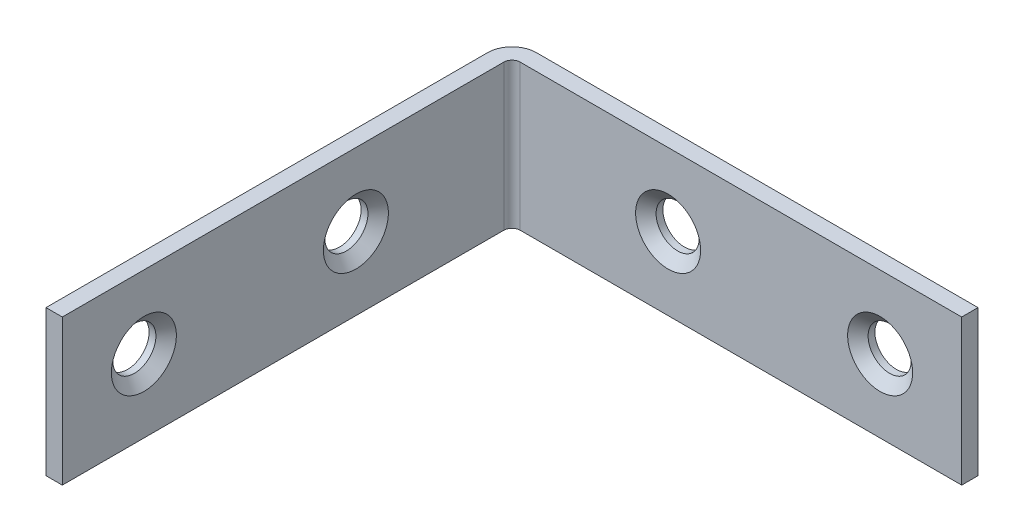
ISO-10303-21;
HEADER;
FILE_DESCRIPTION(('STEP AP214'),'2;1');
FILE_NAME('part.step','',(''),(''),'','','');
FILE_SCHEMA(('AUTOMOTIVE_DESIGN { 1 0 10303 214 1 1 1 1 }'));
ENDSEC;
DATA;
#1=APPLICATION_CONTEXT('core data for automotive mechanical design processes');
#2=APPLICATION_PROTOCOL_DEFINITION('international standard','automotive_design',2000,#1);
#3=PRODUCT_CONTEXT('',#1,'mechanical');
#4=PRODUCT('Part','Part','',(#3));
#5=PRODUCT_RELATED_PRODUCT_CATEGORY('part','',(#4));
#6=PRODUCT_DEFINITION_FORMATION('','',#4);
#7=PRODUCT_DEFINITION_CONTEXT('part definition',#1,'design');
#8=PRODUCT_DEFINITION('design','',#6,#7);
#9=PRODUCT_DEFINITION_SHAPE('','',#8);
#10=(LENGTH_UNIT() NAMED_UNIT(*) SI_UNIT(.MILLI.,.METRE.));
#11=(NAMED_UNIT(*) PLANE_ANGLE_UNIT() SI_UNIT($,.RADIAN.));
#12=(NAMED_UNIT(*) SI_UNIT($,.STERADIAN.) SOLID_ANGLE_UNIT());
#13=UNCERTAINTY_MEASURE_WITH_UNIT(LENGTH_MEASURE(1.E-05),#10,'distance_accuracy_value','');
#14=(GEOMETRIC_REPRESENTATION_CONTEXT(3) GLOBAL_UNCERTAINTY_ASSIGNED_CONTEXT((#13)) GLOBAL_UNIT_ASSIGNED_CONTEXT((#10,
#11,#12)) REPRESENTATION_CONTEXT('',''));
#15=CARTESIAN_POINT('',(0.,0.,0.));
#16=DIRECTION('',(0.,0.,1.));
#17=DIRECTION('',(1.,0.,0.));
#18=AXIS2_PLACEMENT_3D('',#15,#16,#17);
#19=CARTESIAN_POINT('',(2.667,7.9375,1.778));
#20=DIRECTION('',(0.,0.,-1.));
#21=DIRECTION('',(-1.,0.,0.));
#22=AXIS2_PLACEMENT_3D('',#19,#20,#21);
#23=PLANE('',#22);
#24=CARTESIAN_POINT('',(18.796,0.,1.778));
#25=DIRECTION('',(0.,0.,1.));
#26=DIRECTION('',(1.,0.,0.));
#27=AXIS2_PLACEMENT_3D('',#24,#25,#26);
#28=CIRCLE('',#27,3.5433);
#29=CARTESIAN_POINT('',(22.3393,0.,1.778));
#30=VERTEX_POINT('',#29);
#31=EDGE_CURVE('E169',#30,#30,#28,.T.);
#32=ORIENTED_EDGE('',*,*,#31,.F.);
#33=EDGE_LOOP('',(#32));
#34=FACE_BOUND('',#33,.T.);
#35=CARTESIAN_POINT('',(41.91,0.,1.778));
#36=DIRECTION('',(0.,0.,1.));
#37=DIRECTION('',(1.,0.,0.));
#38=AXIS2_PLACEMENT_3D('',#35,#36,#37);
#39=CIRCLE('',#38,3.5433);
#40=CARTESIAN_POINT('',(45.4533,0.,1.778));
#41=VERTEX_POINT('',#40);
#42=EDGE_CURVE('E166',#41,#41,#39,.T.);
#43=ORIENTED_EDGE('',*,*,#42,.F.);
#44=EDGE_LOOP('',(#43));
#45=FACE_BOUND('',#44,.T.);
#46=DIRECTION('',(1.,0.,0.));
#47=VECTOR('',#46,1.);
#48=CARTESIAN_POINT('',(2.667,-7.9375,1.778));
#49=LINE('',#48,#47);
#50=CARTESIAN_POINT('',(2.667,-7.9375,1.778));
#51=VERTEX_POINT('',#50);
#52=CARTESIAN_POINT('',(50.8,-7.9375,1.778));
#53=VERTEX_POINT('',#52);
#54=EDGE_CURVE('E135',#51,#53,#49,.T.);
#55=ORIENTED_EDGE('',*,*,#54,.T.);
#56=DIRECTION('',(0.,-1.,0.));
#57=VECTOR('',#56,1.);
#58=CARTESIAN_POINT('',(50.8,7.9375,1.778));
#59=LINE('',#58,#57);
#60=CARTESIAN_POINT('',(50.8,7.9375,1.778));
#61=VERTEX_POINT('',#60);
#62=EDGE_CURVE('E11',#61,#53,#59,.T.);
#63=ORIENTED_EDGE('',*,*,#62,.F.);
#64=DIRECTION('',(1.,0.,0.));
#65=VECTOR('',#64,1.);
#66=CARTESIAN_POINT('',(2.667,7.9375,1.778));
#67=LINE('',#66,#65);
#68=CARTESIAN_POINT('',(2.667,7.9375,1.778));
#69=VERTEX_POINT('',#68);
#70=EDGE_CURVE('E93',#69,#61,#67,.T.);
#71=ORIENTED_EDGE('',*,*,#70,.F.);
#72=DIRECTION('',(0.,-1.,0.));
#73=VECTOR('',#72,1.);
#74=CARTESIAN_POINT('',(2.667,7.9375,1.778));
#75=LINE('',#74,#73);
#76=EDGE_CURVE('E134',#69,#51,#75,.T.);
#77=ORIENTED_EDGE('',*,*,#76,.T.);
#78=EDGE_LOOP('',(#55,#63,#71,#77));
#79=FACE_BOUND('',#78,.T.);
#80=ADVANCED_FACE('F36',(#34,#45,#79),#23,.F.);
#81=CARTESIAN_POINT('',(50.8,7.9375,0.));
#82=DIRECTION('',(1.,0.,0.));
#83=DIRECTION('',(0.,0.,-1.));
#84=AXIS2_PLACEMENT_3D('',#81,#82,#83);
#85=PLANE('',#84);
#86=DIRECTION('',(0.,0.,1.));
#87=VECTOR('',#86,1.);
#88=CARTESIAN_POINT('',(50.8,-7.9375,0.));
#89=LINE('',#88,#87);
#90=CARTESIAN_POINT('',(50.8,-7.9375,0.));
#91=VERTEX_POINT('',#90);
#92=EDGE_CURVE('E138',#91,#53,#89,.T.);
#93=ORIENTED_EDGE('',*,*,#92,.F.);
#94=DIRECTION('',(0.,-1.,0.));
#95=VECTOR('',#94,1.);
#96=CARTESIAN_POINT('',(50.8,7.9375,0.));
#97=LINE('',#96,#95);
#98=CARTESIAN_POINT('',(50.8,7.9375,0.));
#99=VERTEX_POINT('',#98);
#100=EDGE_CURVE('E45',#99,#91,#97,.T.);
#101=ORIENTED_EDGE('',*,*,#100,.F.);
#102=DIRECTION('',(0.,0.,1.));
#103=VECTOR('',#102,1.);
#104=CARTESIAN_POINT('',(50.8,7.9375,0.));
#105=LINE('',#104,#103);
#106=EDGE_CURVE('E198',#99,#61,#105,.T.);
#107=ORIENTED_EDGE('',*,*,#106,.T.);
#108=ORIENTED_EDGE('',*,*,#62,.T.);
#109=EDGE_LOOP('',(#93,#101,#107,#108));
#110=FACE_BOUND('',#109,.T.);
#111=ADVANCED_FACE('F229',(#110),#85,.T.);
#112=CARTESIAN_POINT('',(2.667,7.9375,0.));
#113=DIRECTION('',(0.,0.,-1.));
#114=DIRECTION('',(-1.,0.,0.));
#115=AXIS2_PLACEMENT_3D('',#112,#113,#114);
#116=PLANE('',#115);
#117=CARTESIAN_POINT('',(18.796,0.,0.));
#118=DIRECTION('',(0.,0.,1.));
#119=DIRECTION('',(1.,0.,0.));
#120=AXIS2_PLACEMENT_3D('',#117,#118,#119);
#121=CIRCLE('',#120,2.3495);
#122=CARTESIAN_POINT('',(21.1455,0.,0.));
#123=VERTEX_POINT('',#122);
#124=EDGE_CURVE('E165',#123,#123,#121,.T.);
#125=ORIENTED_EDGE('',*,*,#124,.T.);
#126=EDGE_LOOP('',(#125));
#127=FACE_BOUND('',#126,.T.);
#128=CARTESIAN_POINT('',(41.91,0.,0.));
#129=DIRECTION('',(0.,0.,1.));
#130=DIRECTION('',(1.,0.,0.));
#131=AXIS2_PLACEMENT_3D('',#128,#129,#130);
#132=CIRCLE('',#131,2.34949999999999);
#133=CARTESIAN_POINT('',(44.2595,0.,0.));
#134=VERTEX_POINT('',#133);
#135=EDGE_CURVE('E139',#134,#134,#132,.T.);
#136=ORIENTED_EDGE('',*,*,#135,.T.);
#137=EDGE_LOOP('',(#136));
#138=FACE_BOUND('',#137,.T.);
#139=DIRECTION('',(1.,0.,0.));
#140=VECTOR('',#139,1.);
#141=CARTESIAN_POINT('',(2.667,-7.9375,0.));
#142=LINE('',#141,#140);
#143=CARTESIAN_POINT('',(2.667,-7.9375,0.));
#144=VERTEX_POINT('',#143);
#145=EDGE_CURVE('E142',#144,#91,#142,.T.);
#146=ORIENTED_EDGE('',*,*,#145,.F.);
#147=DIRECTION('',(0.,-1.,0.));
#148=VECTOR('',#147,1.);
#149=CARTESIAN_POINT('',(2.667,7.9375,0.));
#150=LINE('',#149,#148);
#151=CARTESIAN_POINT('',(2.667,7.9375,0.));
#152=VERTEX_POINT('',#151);
#153=EDGE_CURVE('E159',#152,#144,#150,.T.);
#154=ORIENTED_EDGE('',*,*,#153,.F.);
#155=DIRECTION('',(1.,0.,0.));
#156=VECTOR('',#155,1.);
#157=CARTESIAN_POINT('',(2.667,7.9375,0.));
#158=LINE('',#157,#156);
#159=EDGE_CURVE('E201',#152,#99,#158,.T.);
#160=ORIENTED_EDGE('',*,*,#159,.T.);
#161=ORIENTED_EDGE('',*,*,#100,.T.);
#162=EDGE_LOOP('',(#146,#154,#160,#161));
#163=FACE_BOUND('',#162,.T.);
#164=ADVANCED_FACE('F234',(#127,#138,#163),#116,.T.);
#165=CARTESIAN_POINT('',(2.667,7.9375,2.667));
#166=DIRECTION('',(0.,-1.,0.));
#167=DIRECTION('',(0.,0.,-1.));
#168=AXIS2_PLACEMENT_3D('',#165,#166,#167);
#169=CYLINDRICAL_SURFACE('',#168,2.667);
#170=CARTESIAN_POINT('',(2.667,-7.9375,2.667));
#171=DIRECTION('',(0.,-1.,0.));
#172=DIRECTION('',(0.,0.,1.));
#173=AXIS2_PLACEMENT_3D('',#170,#171,#172);
#174=CIRCLE('',#173,2.667);
#175=CARTESIAN_POINT('',(0.,-7.9375,2.667));
#176=VERTEX_POINT('',#175);
#177=EDGE_CURVE('E145',#176,#144,#174,.T.);
#178=ORIENTED_EDGE('',*,*,#177,.F.);
#179=DIRECTION('',(0.,-1.,0.));
#180=VECTOR('',#179,1.);
#181=CARTESIAN_POINT('',(0.,7.9375,2.667));
#182=LINE('',#181,#180);
#183=CARTESIAN_POINT('',(0.,7.9375,2.667));
#184=VERTEX_POINT('',#183);
#185=EDGE_CURVE('E157',#184,#176,#182,.T.);
#186=ORIENTED_EDGE('',*,*,#185,.F.);
#187=CARTESIAN_POINT('',(2.667,7.9375,2.667));
#188=DIRECTION('',(0.,-1.,0.));
#189=DIRECTION('',(0.,0.,1.));
#190=AXIS2_PLACEMENT_3D('',#187,#188,#189);
#191=CIRCLE('',#190,2.667);
#192=EDGE_CURVE('E129',#184,#152,#191,.T.);
#193=ORIENTED_EDGE('',*,*,#192,.T.);
#194=ORIENTED_EDGE('',*,*,#153,.T.);
#195=EDGE_LOOP('',(#178,#186,#193,#194));
#196=FACE_BOUND('',#195,.T.);
#197=ADVANCED_FACE('F206',(#196),#169,.T.);
#198=CARTESIAN_POINT('',(0.,7.9375,50.8));
#199=DIRECTION('',(-1.,0.,0.));
#200=DIRECTION('',(0.,0.,1.));
#201=AXIS2_PLACEMENT_3D('',#198,#199,#200);
#202=PLANE('',#201);
#203=CARTESIAN_POINT('',(0.,0.,18.796));
#204=DIRECTION('',(1.,0.,0.));
#205=DIRECTION('',(0.,0.,1.));
#206=AXIS2_PLACEMENT_3D('',#203,#204,#205);
#207=CIRCLE('',#206,2.3495);
#208=CARTESIAN_POINT('',(0.,0.,21.1455));
#209=VERTEX_POINT('',#208);
#210=EDGE_CURVE('E172',#209,#209,#207,.T.);
#211=ORIENTED_EDGE('',*,*,#210,.T.);
#212=EDGE_LOOP('',(#211));
#213=FACE_BOUND('',#212,.T.);
#214=CARTESIAN_POINT('',(-1.50270421106491E-13,0.,41.91));
#215=DIRECTION('',(1.,0.,0.));
#216=DIRECTION('',(0.,0.,1.));
#217=AXIS2_PLACEMENT_3D('',#214,#215,#216);
#218=CIRCLE('',#217,2.34949999999999);
#219=CARTESIAN_POINT('',(-1.57313287396654E-13,0.,44.2595));
#220=VERTEX_POINT('',#219);
#221=EDGE_CURVE('E177',#220,#220,#218,.T.);
#222=ORIENTED_EDGE('',*,*,#221,.T.);
#223=EDGE_LOOP('',(#222));
#224=FACE_BOUND('',#223,.T.);
#225=DIRECTION('',(0.,0.,-1.));
#226=VECTOR('',#225,1.);
#227=CARTESIAN_POINT('',(0.,-7.9375,50.8));
#228=LINE('',#227,#226);
#229=CARTESIAN_POINT('',(0.,-7.9375,50.8));
#230=VERTEX_POINT('',#229);
#231=EDGE_CURVE('E148',#230,#176,#228,.T.);
#232=ORIENTED_EDGE('',*,*,#231,.F.);
#233=DIRECTION('',(0.,-1.,0.));
#234=VECTOR('',#233,1.);
#235=CARTESIAN_POINT('',(0.,7.9375,50.8));
#236=LINE('',#235,#234);
#237=CARTESIAN_POINT('',(0.,7.9375,50.8));
#238=VERTEX_POINT('',#237);
#239=EDGE_CURVE('E117',#238,#230,#236,.T.);
#240=ORIENTED_EDGE('',*,*,#239,.F.);
#241=DIRECTION('',(0.,0.,-1.));
#242=VECTOR('',#241,1.);
#243=CARTESIAN_POINT('',(0.,7.9375,50.8));
#244=LINE('',#243,#242);
#245=EDGE_CURVE('E127',#238,#184,#244,.T.);
#246=ORIENTED_EDGE('',*,*,#245,.T.);
#247=ORIENTED_EDGE('',*,*,#185,.T.);
#248=EDGE_LOOP('',(#232,#240,#246,#247));
#249=FACE_BOUND('',#248,.T.);
#250=ADVANCED_FACE('F211',(#213,#224,#249),#202,.T.);
#251=CARTESIAN_POINT('',(1.778,7.9375,50.8));
#252=DIRECTION('',(0.,0.,1.));
#253=DIRECTION('',(1.,0.,0.));
#254=AXIS2_PLACEMENT_3D('',#251,#252,#253);
#255=PLANE('',#254);
#256=DIRECTION('',(-1.,0.,0.));
#257=VECTOR('',#256,1.);
#258=CARTESIAN_POINT('',(1.778,-7.9375,50.8));
#259=LINE('',#258,#257);
#260=CARTESIAN_POINT('',(1.778,-7.9375,50.8));
#261=VERTEX_POINT('',#260);
#262=EDGE_CURVE('E116',#261,#230,#259,.T.);
#263=ORIENTED_EDGE('',*,*,#262,.F.);
#264=DIRECTION('',(0.,-1.,0.));
#265=VECTOR('',#264,1.);
#266=CARTESIAN_POINT('',(1.778,7.9375,50.8));
#267=LINE('',#266,#265);
#268=CARTESIAN_POINT('',(1.778,7.9375,50.8));
#269=VERTEX_POINT('',#268);
#270=EDGE_CURVE('E110',#269,#261,#267,.T.);
#271=ORIENTED_EDGE('',*,*,#270,.F.);
#272=DIRECTION('',(-1.,0.,0.));
#273=VECTOR('',#272,1.);
#274=CARTESIAN_POINT('',(1.778,7.9375,50.8));
#275=LINE('',#274,#273);
#276=EDGE_CURVE('E114',#269,#238,#275,.T.);
#277=ORIENTED_EDGE('',*,*,#276,.T.);
#278=ORIENTED_EDGE('',*,*,#239,.T.);
#279=EDGE_LOOP('',(#263,#271,#277,#278));
#280=FACE_BOUND('',#279,.T.);
#281=ADVANCED_FACE('F112',(#280),#255,.T.);
#282=CARTESIAN_POINT('',(1.778,7.9375,50.8));
#283=DIRECTION('',(-1.,0.,0.));
#284=DIRECTION('',(0.,0.,1.));
#285=AXIS2_PLACEMENT_3D('',#282,#283,#284);
#286=PLANE('',#285);
#287=CARTESIAN_POINT('',(1.77799999999994,0.,18.796));
#288=DIRECTION('',(1.,0.,0.));
#289=DIRECTION('',(0.,0.,1.));
#290=AXIS2_PLACEMENT_3D('',#287,#288,#289);
#291=CIRCLE('',#290,3.5433);
#292=CARTESIAN_POINT('',(1.77799999999993,0.,22.3393));
#293=VERTEX_POINT('',#292);
#294=EDGE_CURVE('E184',#293,#293,#291,.T.);
#295=ORIENTED_EDGE('',*,*,#294,.F.);
#296=EDGE_LOOP('',(#295));
#297=FACE_BOUND('',#296,.T.);
#298=CARTESIAN_POINT('',(1.77799999999987,0.,41.91));
#299=DIRECTION('',(1.,0.,0.));
#300=DIRECTION('',(0.,0.,1.));
#301=AXIS2_PLACEMENT_3D('',#298,#299,#300);
#302=CIRCLE('',#301,3.5433);
#303=CARTESIAN_POINT('',(1.77799999999986,0.,45.4533));
#304=VERTEX_POINT('',#303);
#305=EDGE_CURVE('E173',#304,#304,#302,.T.);
#306=ORIENTED_EDGE('',*,*,#305,.F.);
#307=EDGE_LOOP('',(#306));
#308=FACE_BOUND('',#307,.T.);
#309=DIRECTION('',(0.,0.,-1.));
#310=VECTOR('',#309,1.);
#311=CARTESIAN_POINT('',(1.778,-7.9375,50.8));
#312=LINE('',#311,#310);
#313=CARTESIAN_POINT('',(1.778,-7.9375,2.667));
#314=VERTEX_POINT('',#313);
#315=EDGE_CURVE('E81',#261,#314,#312,.T.);
#316=ORIENTED_EDGE('',*,*,#315,.T.);
#317=DIRECTION('',(0.,-1.,0.));
#318=VECTOR('',#317,1.);
#319=CARTESIAN_POINT('',(1.778,7.9375,2.667));
#320=LINE('',#319,#318);
#321=CARTESIAN_POINT('',(1.778,7.9375,2.667));
#322=VERTEX_POINT('',#321);
#323=EDGE_CURVE('E118',#322,#314,#320,.T.);
#324=ORIENTED_EDGE('',*,*,#323,.F.);
#325=DIRECTION('',(0.,0.,-1.));
#326=VECTOR('',#325,1.);
#327=CARTESIAN_POINT('',(1.778,7.9375,50.8));
#328=LINE('',#327,#326);
#329=EDGE_CURVE('E120',#269,#322,#328,.T.);
#330=ORIENTED_EDGE('',*,*,#329,.F.);
#331=ORIENTED_EDGE('',*,*,#270,.T.);
#332=EDGE_LOOP('',(#316,#324,#330,#331));
#333=FACE_BOUND('',#332,.T.);
#334=ADVANCED_FACE('F121',(#297,#308,#333),#286,.F.);
#335=CARTESIAN_POINT('',(2.667,7.9375,2.667));
#336=DIRECTION('',(0.,-1.,0.));
#337=DIRECTION('',(0.,0.,-1.));
#338=AXIS2_PLACEMENT_3D('',#335,#336,#337);
#339=CYLINDRICAL_SURFACE('',#338,0.889);
#340=CARTESIAN_POINT('',(2.667,-7.9375,2.667));
#341=DIRECTION('',(0.,1.,0.));
#342=DIRECTION('',(1.,0.,0.));
#343=AXIS2_PLACEMENT_3D('',#340,#341,#342);
#344=CIRCLE('',#343,0.889);
#345=EDGE_CURVE('E87',#314,#51,#344,.F.);
#346=ORIENTED_EDGE('',*,*,#345,.T.);
#347=ORIENTED_EDGE('',*,*,#76,.F.);
#348=CARTESIAN_POINT('',(2.667,7.9375,2.667));
#349=DIRECTION('',(0.,1.,0.));
#350=DIRECTION('',(1.,0.,0.));
#351=AXIS2_PLACEMENT_3D('',#348,#349,#350);
#352=CIRCLE('',#351,0.889);
#353=EDGE_CURVE('E54',#322,#69,#352,.F.);
#354=ORIENTED_EDGE('',*,*,#353,.F.);
#355=ORIENTED_EDGE('',*,*,#323,.T.);
#356=EDGE_LOOP('',(#346,#347,#354,#355));
#357=FACE_BOUND('',#356,.T.);
#358=ADVANCED_FACE('F217',(#357),#339,.F.);
#359=CARTESIAN_POINT('',(2.667,7.9375,2.667));
#360=DIRECTION('',(0.,-1.,0.));
#361=DIRECTION('',(-1.,0.,0.));
#362=AXIS2_PLACEMENT_3D('',#359,#360,#361);
#363=PLANE('',#362);
#364=ORIENTED_EDGE('',*,*,#70,.T.);
#365=ORIENTED_EDGE('',*,*,#106,.F.);
#366=ORIENTED_EDGE('',*,*,#159,.F.);
#367=ORIENTED_EDGE('',*,*,#192,.F.);
#368=ORIENTED_EDGE('',*,*,#245,.F.);
#369=ORIENTED_EDGE('',*,*,#276,.F.);
#370=ORIENTED_EDGE('',*,*,#329,.T.);
#371=ORIENTED_EDGE('',*,*,#353,.T.);
#372=EDGE_LOOP('',(#364,#365,#366,#367,#368,#369,#370,#371));
#373=FACE_BOUND('',#372,.T.);
#374=ADVANCED_FACE('F124',(#373),#363,.F.);
#375=CARTESIAN_POINT('',(2.667,-7.9375,2.667));
#376=DIRECTION('',(0.,-1.,0.));
#377=DIRECTION('',(-1.,0.,0.));
#378=AXIS2_PLACEMENT_3D('',#375,#376,#377);
#379=PLANE('',#378);
#380=ORIENTED_EDGE('',*,*,#54,.F.);
#381=ORIENTED_EDGE('',*,*,#345,.F.);
#382=ORIENTED_EDGE('',*,*,#315,.F.);
#383=ORIENTED_EDGE('',*,*,#262,.T.);
#384=ORIENTED_EDGE('',*,*,#231,.T.);
#385=ORIENTED_EDGE('',*,*,#177,.T.);
#386=ORIENTED_EDGE('',*,*,#145,.T.);
#387=ORIENTED_EDGE('',*,*,#92,.T.);
#388=EDGE_LOOP('',(#380,#381,#382,#383,#384,#385,#386,#387));
#389=FACE_BOUND('',#388,.T.);
#390=ADVANCED_FACE('F214',(#389),#379,.T.);
#391=CARTESIAN_POINT('',(41.91,0.,0.));
#392=DIRECTION('',(0.,0.,1.));
#393=DIRECTION('',(1.,0.,0.));
#394=AXIS2_PLACEMENT_3D('',#391,#392,#393);
#395=CYLINDRICAL_SURFACE('',#394,2.34949999999999);
#396=CARTESIAN_POINT('',(41.91,0.,0.740245492394984));
#397=DIRECTION('',(0.,0.,1.));
#398=DIRECTION('',(1.,0.,0.));
#399=AXIS2_PLACEMENT_3D('',#396,#397,#398);
#400=CIRCLE('',#399,2.34949999999999);
#401=CARTESIAN_POINT('',(44.2595,0.,0.740245492394984));
#402=VERTEX_POINT('',#401);
#403=EDGE_CURVE('E162',#402,#402,#400,.T.);
#404=ORIENTED_EDGE('',*,*,#403,.T.);
#405=EDGE_LOOP('',(#404));
#406=FACE_BOUND('',#405,.T.);
#407=ORIENTED_EDGE('',*,*,#135,.F.);
#408=EDGE_LOOP('',(#407));
#409=FACE_BOUND('',#408,.T.);
#410=ADVANCED_FACE('F248',(#406,#409),#395,.F.);
#411=CARTESIAN_POINT('',(18.796,0.,0.));
#412=DIRECTION('',(0.,0.,1.));
#413=DIRECTION('',(1.,0.,0.));
#414=AXIS2_PLACEMENT_3D('',#411,#412,#413);
#415=CYLINDRICAL_SURFACE('',#414,2.3495);
#416=CARTESIAN_POINT('',(18.796,0.,0.740245492394996));
#417=DIRECTION('',(0.,0.,1.));
#418=DIRECTION('',(1.,0.,0.));
#419=AXIS2_PLACEMENT_3D('',#416,#417,#418);
#420=CIRCLE('',#419,2.3495);
#421=CARTESIAN_POINT('',(21.1455,0.,0.740245492394996));
#422=VERTEX_POINT('',#421);
#423=EDGE_CURVE('E167',#422,#422,#420,.T.);
#424=ORIENTED_EDGE('',*,*,#423,.T.);
#425=EDGE_LOOP('',(#424));
#426=FACE_BOUND('',#425,.T.);
#427=ORIENTED_EDGE('',*,*,#124,.F.);
#428=EDGE_LOOP('',(#427));
#429=FACE_BOUND('',#428,.T.);
#430=ADVANCED_FACE('F244',(#426,#429),#415,.F.);
#431=CARTESIAN_POINT('',(41.91,0.,1.778));
#432=DIRECTION('',(0.,0.,1.));
#433=DIRECTION('',(1.,0.,0.));
#434=AXIS2_PLACEMENT_3D('',#431,#432,#433);
#435=CONICAL_SURFACE('',#434,3.5433,0.855211333477223);
#436=ORIENTED_EDGE('',*,*,#42,.T.);
#437=EDGE_LOOP('',(#436));
#438=FACE_BOUND('',#437,.T.);
#439=ORIENTED_EDGE('',*,*,#403,.F.);
#440=EDGE_LOOP('',(#439));
#441=FACE_BOUND('',#440,.T.);
#442=ADVANCED_FACE('F240',(#438,#441),#435,.F.);
#443=CARTESIAN_POINT('',(18.796,0.,1.778));
#444=DIRECTION('',(0.,0.,1.));
#445=DIRECTION('',(1.,0.,0.));
#446=AXIS2_PLACEMENT_3D('',#443,#444,#445);
#447=CONICAL_SURFACE('',#446,3.5433,0.855211333477223);
#448=ORIENTED_EDGE('',*,*,#31,.T.);
#449=EDGE_LOOP('',(#448));
#450=FACE_BOUND('',#449,.T.);
#451=ORIENTED_EDGE('',*,*,#423,.F.);
#452=EDGE_LOOP('',(#451));
#453=FACE_BOUND('',#452,.T.);
#454=ADVANCED_FACE('F243',(#450,#453),#447,.F.);
#455=CARTESIAN_POINT('',(-1.50270421106491E-13,0.,41.91));
#456=DIRECTION('',(1.,0.,0.));
#457=DIRECTION('',(0.,0.,-1.));
#458=AXIS2_PLACEMENT_3D('',#455,#456,#457);
#459=CYLINDRICAL_SURFACE('',#458,2.34949999999999);
#460=CARTESIAN_POINT('',(0.740245492394859,0.,41.91));
#461=DIRECTION('',(1.,0.,0.));
#462=DIRECTION('',(0.,0.,-1.));
#463=AXIS2_PLACEMENT_3D('',#460,#461,#462);
#464=CIRCLE('',#463,2.34949999999999);
#465=CARTESIAN_POINT('',(0.740245492394867,0.,39.5605));
#466=VERTEX_POINT('',#465);
#467=EDGE_CURVE('E170',#466,#466,#464,.T.);
#468=ORIENTED_EDGE('',*,*,#467,.T.);
#469=EDGE_LOOP('',(#468));
#470=FACE_BOUND('',#469,.T.);
#471=ORIENTED_EDGE('',*,*,#221,.F.);
#472=EDGE_LOOP('',(#471));
#473=FACE_BOUND('',#472,.T.);
#474=ADVANCED_FACE('F285',(#470,#473),#459,.F.);
#475=CARTESIAN_POINT('',(0.,0.,18.796));
#476=DIRECTION('',(1.,0.,0.));
#477=DIRECTION('',(0.,0.,-1.));
#478=AXIS2_PLACEMENT_3D('',#475,#476,#477);
#479=CYLINDRICAL_SURFACE('',#478,2.3495);
#480=CARTESIAN_POINT('',(0.74024549239494,0.,18.796));
#481=DIRECTION('',(1.,0.,0.));
#482=DIRECTION('',(0.,0.,-1.));
#483=AXIS2_PLACEMENT_3D('',#480,#481,#482);
#484=CIRCLE('',#483,2.3495);
#485=CARTESIAN_POINT('',(0.740245492394948,0.,16.4465));
#486=VERTEX_POINT('',#485);
#487=EDGE_CURVE('E39',#486,#486,#484,.T.);
#488=ORIENTED_EDGE('',*,*,#487,.T.);
#489=EDGE_LOOP('',(#488));
#490=FACE_BOUND('',#489,.T.);
#491=ORIENTED_EDGE('',*,*,#210,.F.);
#492=EDGE_LOOP('',(#491));
#493=FACE_BOUND('',#492,.T.);
#494=ADVANCED_FACE('F290',(#490,#493),#479,.F.);
#495=CARTESIAN_POINT('',(1.77799999999987,0.,41.91));
#496=DIRECTION('',(1.,0.,0.));
#497=DIRECTION('',(0.,0.,1.));
#498=AXIS2_PLACEMENT_3D('',#495,#496,#497);
#499=CONICAL_SURFACE('',#498,3.5433,0.855211333477223);
#500=ORIENTED_EDGE('',*,*,#305,.T.);
#501=EDGE_LOOP('',(#500));
#502=FACE_BOUND('',#501,.T.);
#503=ORIENTED_EDGE('',*,*,#467,.F.);
#504=EDGE_LOOP('',(#503));
#505=FACE_BOUND('',#504,.T.);
#506=ADVANCED_FACE('F301',(#502,#505),#499,.F.);
#507=CARTESIAN_POINT('',(1.77799999999994,0.,18.796));
#508=DIRECTION('',(1.,0.,0.));
#509=DIRECTION('',(0.,0.,1.));
#510=AXIS2_PLACEMENT_3D('',#507,#508,#509);
#511=CONICAL_SURFACE('',#510,3.5433,0.855211333477223);
#512=ORIENTED_EDGE('',*,*,#294,.T.);
#513=EDGE_LOOP('',(#512));
#514=FACE_BOUND('',#513,.T.);
#515=ORIENTED_EDGE('',*,*,#487,.F.);
#516=EDGE_LOOP('',(#515));
#517=FACE_BOUND('',#516,.T.);
#518=ADVANCED_FACE('F311',(#514,#517),#511,.F.);
#519=CLOSED_SHELL('',(#80,#111,#164,#197,#250,#281,#334,#358,#374,#390,#410,#430,#442,#454,#474,
#494,#506,#518));
#520=MANIFOLD_SOLID_BREP('B2',#519);
#521=ADVANCED_BREP_SHAPE_REPRESENTATION('',(#18,#520),#14);
#522=SHAPE_DEFINITION_REPRESENTATION(#9,#521);
ENDSEC;
END-ISO-10303-21;
